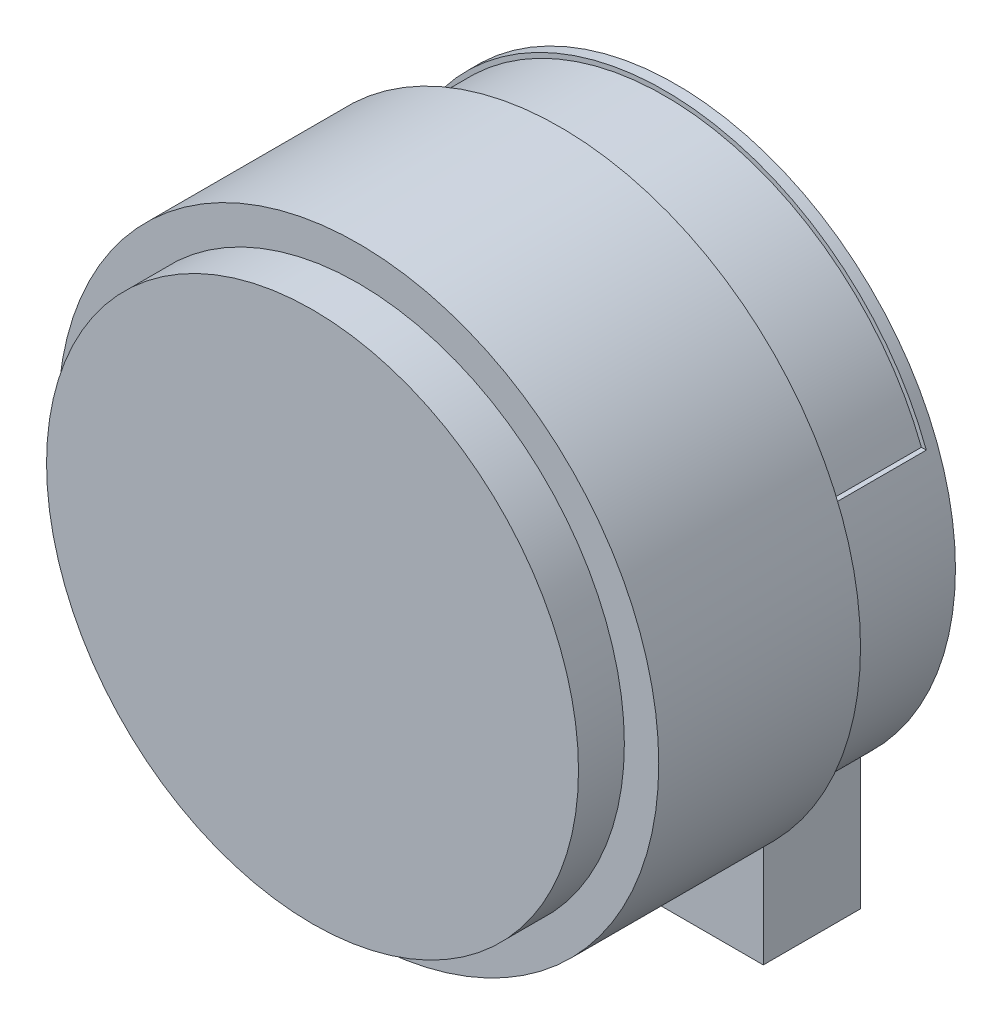
ISO-10303-21;
HEADER;
FILE_DESCRIPTION(('STEP AP214'),'2;1');
FILE_NAME('part.step','',(''),(''),'','','');
FILE_SCHEMA(('AUTOMOTIVE_DESIGN { 1 0 10303 214 1 1 1 1 }'));
ENDSEC;
DATA;
#1=APPLICATION_CONTEXT('core data for automotive mechanical design processes');
#2=APPLICATION_PROTOCOL_DEFINITION('international standard','automotive_design',2000,#1);
#3=PRODUCT_CONTEXT('',#1,'mechanical');
#4=PRODUCT('Part','Part','',(#3));
#5=PRODUCT_RELATED_PRODUCT_CATEGORY('part','',(#4));
#6=PRODUCT_DEFINITION_FORMATION('','',#4);
#7=PRODUCT_DEFINITION_CONTEXT('part definition',#1,'design');
#8=PRODUCT_DEFINITION('design','',#6,#7);
#9=PRODUCT_DEFINITION_SHAPE('','',#8);
#10=(LENGTH_UNIT() NAMED_UNIT(*) SI_UNIT(.MILLI.,.METRE.));
#11=(NAMED_UNIT(*) PLANE_ANGLE_UNIT() SI_UNIT($,.RADIAN.));
#12=(NAMED_UNIT(*) SI_UNIT($,.STERADIAN.) SOLID_ANGLE_UNIT());
#13=UNCERTAINTY_MEASURE_WITH_UNIT(LENGTH_MEASURE(1.E-05),#10,'distance_accuracy_value','');
#14=(GEOMETRIC_REPRESENTATION_CONTEXT(3) GLOBAL_UNCERTAINTY_ASSIGNED_CONTEXT((#13)) GLOBAL_UNIT_ASSIGNED_CONTEXT((#10,
#11,#12)) REPRESENTATION_CONTEXT('',''));
#15=CARTESIAN_POINT('',(0.,0.,0.));
#16=DIRECTION('',(0.,0.,1.));
#17=DIRECTION('',(1.,0.,0.));
#18=AXIS2_PLACEMENT_3D('',#15,#16,#17);
#19=CARTESIAN_POINT('',(0.,0.,12.6));
#20=DIRECTION('',(0.,0.,-1.));
#21=DIRECTION('',(-1.,0.,0.));
#22=AXIS2_PLACEMENT_3D('',#19,#20,#21);
#23=CYLINDRICAL_SURFACE('',#22,30.5);
#24=CARTESIAN_POINT('',(0.,0.,11.7));
#25=DIRECTION('',(0.,0.,-1.));
#26=DIRECTION('',(-1.,0.,0.));
#27=AXIS2_PLACEMENT_3D('',#24,#25,#26);
#28=CIRCLE('',#27,30.5);
#29=CARTESIAN_POINT('',(21.25,-21.8789282187222,11.7));
#30=VERTEX_POINT('',#29);
#31=CARTESIAN_POINT('',(-21.25,-21.8789282187222,11.7));
#32=VERTEX_POINT('',#31);
#33=EDGE_CURVE('E196',#30,#32,#28,.T.);
#34=ORIENTED_EDGE('',*,*,#33,.F.);
#35=DIRECTION('',(0.,0.,-1.));
#36=VECTOR('',#35,1.);
#37=CARTESIAN_POINT('',(21.25,-21.8789282187222,11.7));
#38=LINE('',#37,#36);
#39=CARTESIAN_POINT('',(21.25,-21.8789282187222,1.1));
#40=VERTEX_POINT('',#39);
#41=EDGE_CURVE('E210',#30,#40,#38,.T.);
#42=ORIENTED_EDGE('',*,*,#41,.T.);
#43=CARTESIAN_POINT('',(0.,0.,1.1));
#44=DIRECTION('',(0.,0.,-1.));
#45=DIRECTION('',(-1.,0.,0.));
#46=AXIS2_PLACEMENT_3D('',#43,#44,#45);
#47=CIRCLE('',#46,30.5);
#48=CARTESIAN_POINT('',(-21.25,-21.8789282187222,1.1));
#49=VERTEX_POINT('',#48);
#50=EDGE_CURVE('E182',#40,#49,#47,.T.);
#51=ORIENTED_EDGE('',*,*,#50,.T.);
#52=DIRECTION('',(0.,0.,-1.));
#53=VECTOR('',#52,1.);
#54=CARTESIAN_POINT('',(-21.25,-21.8789282187222,11.7));
#55=LINE('',#54,#53);
#56=EDGE_CURVE('E207',#32,#49,#55,.T.);
#57=ORIENTED_EDGE('',*,*,#56,.F.);
#58=EDGE_LOOP('',(#34,#42,#51,#57));
#59=FACE_BOUND('',#58,.T.);
#60=CARTESIAN_POINT('',(0.,0.,12.6));
#61=DIRECTION('',(0.,0.,1.));
#62=DIRECTION('',(1.,0.,0.));
#63=AXIS2_PLACEMENT_3D('',#60,#61,#62);
#64=CIRCLE('',#63,30.5);
#65=CARTESIAN_POINT('',(30.5,0.,12.6));
#66=VERTEX_POINT('',#65);
#67=EDGE_CURVE('E58',#66,#66,#64,.T.);
#68=ORIENTED_EDGE('',*,*,#67,.F.);
#69=EDGE_LOOP('',(#68));
#70=FACE_BOUND('',#69,.T.);
#71=CARTESIAN_POINT('',(0.,0.,0.));
#72=DIRECTION('',(0.,0.,1.));
#73=DIRECTION('',(1.,0.,0.));
#74=AXIS2_PLACEMENT_3D('',#71,#72,#73);
#75=CIRCLE('',#74,30.5);
#76=CARTESIAN_POINT('',(30.5,0.,0.));
#77=VERTEX_POINT('',#76);
#78=EDGE_CURVE('E52',#77,#77,#75,.T.);
#79=ORIENTED_EDGE('',*,*,#78,.T.);
#80=EDGE_LOOP('',(#79));
#81=FACE_BOUND('',#80,.T.);
#82=CARTESIAN_POINT('',(0.,0.,12.));
#83=DIRECTION('',(0.,0.,-1.));
#84=DIRECTION('',(-1.,0.,0.));
#85=AXIS2_PLACEMENT_3D('',#82,#83,#84);
#86=CIRCLE('',#85,30.5);
#87=CARTESIAN_POINT('',(-28.5238496700568,10.8,12.));
#88=VERTEX_POINT('',#87);
#89=CARTESIAN_POINT('',(28.5238496700568,10.8,12.));
#90=VERTEX_POINT('',#89);
#91=EDGE_CURVE('E143',#88,#90,#86,.T.);
#92=ORIENTED_EDGE('',*,*,#91,.F.);
#93=DIRECTION('',(0.,0.,-1.));
#94=VECTOR('',#93,1.);
#95=CARTESIAN_POINT('',(-28.5238496700568,10.8,12.));
#96=LINE('',#95,#94);
#97=CARTESIAN_POINT('',(-28.5238496700568,10.8,1.2));
#98=VERTEX_POINT('',#97);
#99=EDGE_CURVE('E128',#88,#98,#96,.T.);
#100=ORIENTED_EDGE('',*,*,#99,.T.);
#101=CARTESIAN_POINT('',(0.,0.,1.2));
#102=DIRECTION('',(0.,0.,-1.));
#103=DIRECTION('',(-1.,0.,0.));
#104=AXIS2_PLACEMENT_3D('',#101,#102,#103);
#105=CIRCLE('',#104,30.5);
#106=CARTESIAN_POINT('',(28.5238496700568,10.8,1.2));
#107=VERTEX_POINT('',#106);
#108=EDGE_CURVE('E239',#98,#107,#105,.T.);
#109=ORIENTED_EDGE('',*,*,#108,.T.);
#110=DIRECTION('',(0.,0.,-1.));
#111=VECTOR('',#110,1.);
#112=CARTESIAN_POINT('',(28.5238496700568,10.8,12.));
#113=LINE('',#112,#111);
#114=EDGE_CURVE('E150',#90,#107,#113,.T.);
#115=ORIENTED_EDGE('',*,*,#114,.F.);
#116=EDGE_LOOP('',(#92,#100,#109,#115));
#117=FACE_BOUND('',#116,.T.);
#118=ADVANCED_FACE('F49',(#59,#70,#81,#117),#23,.T.);
#119=CARTESIAN_POINT('',(0.,0.,0.));
#120=DIRECTION('',(0.,0.,1.));
#121=DIRECTION('',(1.,0.,0.));
#122=AXIS2_PLACEMENT_3D('',#119,#120,#121);
#123=PLANE('',#122);
#124=CARTESIAN_POINT('',(0.,0.,0.));
#125=DIRECTION('',(0.,0.,-1.));
#126=DIRECTION('',(-1.,0.,0.));
#127=AXIS2_PLACEMENT_3D('',#124,#125,#126);
#128=CIRCLE('',#127,27.75);
#129=CARTESIAN_POINT('',(-27.75,0.,0.));
#130=VERTEX_POINT('',#129);
#131=EDGE_CURVE('E156',#130,#130,#128,.T.);
#132=ORIENTED_EDGE('',*,*,#131,.F.);
#133=EDGE_LOOP('',(#132));
#134=FACE_BOUND('',#133,.T.);
#135=ORIENTED_EDGE('',*,*,#78,.F.);
#136=EDGE_LOOP('',(#135));
#137=FACE_BOUND('',#136,.T.);
#138=ADVANCED_FACE('F254',(#134,#137),#123,.F.);
#139=CARTESIAN_POINT('',(0.,0.,34.6));
#140=DIRECTION('',(0.,0.,-1.));
#141=DIRECTION('',(-1.,0.,0.));
#142=AXIS2_PLACEMENT_3D('',#139,#140,#141);
#143=CYLINDRICAL_SURFACE('',#142,32.75);
#144=CARTESIAN_POINT('',(0.,0.,34.6));
#145=DIRECTION('',(0.,0.,1.));
#146=DIRECTION('',(1.,0.,0.));
#147=AXIS2_PLACEMENT_3D('',#144,#145,#146);
#148=CIRCLE('',#147,32.75);
#149=CARTESIAN_POINT('',(32.75,0.,34.6));
#150=VERTEX_POINT('',#149);
#151=EDGE_CURVE('E228',#150,#150,#148,.T.);
#152=ORIENTED_EDGE('',*,*,#151,.F.);
#153=EDGE_LOOP('',(#152));
#154=FACE_BOUND('',#153,.T.);
#155=CARTESIAN_POINT('',(0.,0.,12.6));
#156=DIRECTION('',(0.,0.,1.));
#157=DIRECTION('',(1.,0.,0.));
#158=AXIS2_PLACEMENT_3D('',#155,#156,#157);
#159=CIRCLE('',#158,32.75);
#160=CARTESIAN_POINT('',(32.75,0.,12.6));
#161=VERTEX_POINT('',#160);
#162=EDGE_CURVE('E224',#161,#161,#159,.T.);
#163=ORIENTED_EDGE('',*,*,#162,.T.);
#164=EDGE_LOOP('',(#163));
#165=FACE_BOUND('',#164,.T.);
#166=ADVANCED_FACE('F261',(#154,#165),#143,.T.);
#167=CARTESIAN_POINT('',(0.,0.,34.6));
#168=DIRECTION('',(0.,0.,1.));
#169=DIRECTION('',(1.,0.,0.));
#170=AXIS2_PLACEMENT_3D('',#167,#168,#169);
#171=PLANE('',#170);
#172=CARTESIAN_POINT('',(0.,0.,34.6));
#173=DIRECTION('',(0.,0.,1.));
#174=DIRECTION('',(1.,0.,0.));
#175=AXIS2_PLACEMENT_3D('',#172,#173,#174);
#176=CIRCLE('',#175,29.);
#177=CARTESIAN_POINT('',(29.,0.,34.6));
#178=VERTEX_POINT('',#177);
#179=EDGE_CURVE('E11',#178,#178,#176,.T.);
#180=ORIENTED_EDGE('',*,*,#179,.F.);
#181=EDGE_LOOP('',(#180));
#182=FACE_BOUND('',#181,.T.);
#183=ORIENTED_EDGE('',*,*,#151,.T.);
#184=EDGE_LOOP('',(#183));
#185=FACE_BOUND('',#184,.T.);
#186=ADVANCED_FACE('F313',(#182,#185),#171,.T.);
#187=CARTESIAN_POINT('',(0.,0.,12.6));
#188=DIRECTION('',(0.,0.,1.));
#189=DIRECTION('',(1.,0.,0.));
#190=AXIS2_PLACEMENT_3D('',#187,#188,#189);
#191=PLANE('',#190);
#192=ORIENTED_EDGE('',*,*,#67,.T.);
#193=EDGE_LOOP('',(#192));
#194=FACE_BOUND('',#193,.T.);
#195=ORIENTED_EDGE('',*,*,#162,.F.);
#196=EDGE_LOOP('',(#195));
#197=FACE_BOUND('',#196,.T.);
#198=ADVANCED_FACE('F311',(#194,#197),#191,.F.);
#199=CARTESIAN_POINT('',(0.,0.,39.6));
#200=DIRECTION('',(0.,0.,-1.));
#201=DIRECTION('',(-1.,0.,0.));
#202=AXIS2_PLACEMENT_3D('',#199,#200,#201);
#203=CYLINDRICAL_SURFACE('',#202,29.);
#204=CARTESIAN_POINT('',(0.,0.,39.6));
#205=DIRECTION('',(0.,0.,1.));
#206=DIRECTION('',(1.,0.,0.));
#207=AXIS2_PLACEMENT_3D('',#204,#205,#206);
#208=CIRCLE('',#207,29.);
#209=CARTESIAN_POINT('',(29.,0.,39.6));
#210=VERTEX_POINT('',#209);
#211=EDGE_CURVE('E220',#210,#210,#208,.T.);
#212=ORIENTED_EDGE('',*,*,#211,.F.);
#213=EDGE_LOOP('',(#212));
#214=FACE_BOUND('',#213,.T.);
#215=ORIENTED_EDGE('',*,*,#179,.T.);
#216=EDGE_LOOP('',(#215));
#217=FACE_BOUND('',#216,.T.);
#218=ADVANCED_FACE('F307',(#214,#217),#203,.T.);
#219=CARTESIAN_POINT('',(0.,0.,39.6));
#220=DIRECTION('',(0.,0.,1.));
#221=DIRECTION('',(1.,0.,0.));
#222=AXIS2_PLACEMENT_3D('',#219,#220,#221);
#223=PLANE('',#222);
#224=ORIENTED_EDGE('',*,*,#211,.T.);
#225=EDGE_LOOP('',(#224));
#226=FACE_BOUND('',#225,.T.);
#227=ADVANCED_FACE('F304',(#226),#223,.T.);
#228=CARTESIAN_POINT('',(-21.25,0.,11.7));
#229=DIRECTION('',(1.,0.,0.));
#230=DIRECTION('',(0.,0.,-1.));
#231=AXIS2_PLACEMENT_3D('',#228,#229,#230);
#232=PLANE('',#231);
#233=DIRECTION('',(0.,-1.,0.));
#234=VECTOR('',#233,1.);
#235=CARTESIAN_POINT('',(-21.25,0.,1.1));
#236=LINE('',#235,#234);
#237=CARTESIAN_POINT('',(-21.25,-36.2,1.1));
#238=VERTEX_POINT('',#237);
#239=EDGE_CURVE('E74',#49,#238,#236,.T.);
#240=ORIENTED_EDGE('',*,*,#239,.T.);
#241=DIRECTION('',(0.,0.,-1.));
#242=VECTOR('',#241,1.);
#243=CARTESIAN_POINT('',(-21.25,-36.2,11.7));
#244=LINE('',#243,#242);
#245=CARTESIAN_POINT('',(-21.25,-36.2,11.7));
#246=VERTEX_POINT('',#245);
#247=EDGE_CURVE('E217',#246,#238,#244,.T.);
#248=ORIENTED_EDGE('',*,*,#247,.F.);
#249=DIRECTION('',(0.,-1.,0.));
#250=VECTOR('',#249,1.);
#251=CARTESIAN_POINT('',(-21.25,0.,11.7));
#252=LINE('',#251,#250);
#253=EDGE_CURVE('E193',#32,#246,#252,.T.);
#254=ORIENTED_EDGE('',*,*,#253,.F.);
#255=ORIENTED_EDGE('',*,*,#56,.T.);
#256=EDGE_LOOP('',(#240,#248,#254,#255));
#257=FACE_BOUND('',#256,.T.);
#258=ADVANCED_FACE('F276',(#257),#232,.F.);
#259=CARTESIAN_POINT('',(0.,-36.2,11.7));
#260=DIRECTION('',(0.,-1.,0.));
#261=DIRECTION('',(0.,0.,-1.));
#262=AXIS2_PLACEMENT_3D('',#259,#260,#261);
#263=PLANE('',#262);
#264=CARTESIAN_POINT('',(-18.,-36.2,6.4));
#265=DIRECTION('',(0.,-1.,0.));
#266=DIRECTION('',(0.,0.,-1.));
#267=AXIS2_PLACEMENT_3D('',#264,#265,#266);
#268=CIRCLE('',#267,1.5);
#269=CARTESIAN_POINT('',(-18.,-36.2,4.9));
#270=VERTEX_POINT('',#269);
#271=EDGE_CURVE('E172',#270,#270,#268,.T.);
#272=ORIENTED_EDGE('',*,*,#271,.F.);
#273=EDGE_LOOP('',(#272));
#274=FACE_BOUND('',#273,.T.);
#275=CARTESIAN_POINT('',(18.,-36.2,6.4));
#276=DIRECTION('',(0.,-1.,0.));
#277=DIRECTION('',(0.,0.,1.));
#278=AXIS2_PLACEMENT_3D('',#275,#276,#277);
#279=CIRCLE('',#278,1.5);
#280=CARTESIAN_POINT('',(18.,-36.2,7.90000000000001));
#281=VERTEX_POINT('',#280);
#282=EDGE_CURVE('E168',#281,#281,#279,.T.);
#283=ORIENTED_EDGE('',*,*,#282,.F.);
#284=EDGE_LOOP('',(#283));
#285=FACE_BOUND('',#284,.T.);
#286=DIRECTION('',(-1.,0.,0.));
#287=VECTOR('',#286,1.);
#288=CARTESIAN_POINT('',(0.,-36.2,1.1));
#289=LINE('',#288,#287);
#290=CARTESIAN_POINT('',(21.25,-36.2,1.1));
#291=VERTEX_POINT('',#290);
#292=EDGE_CURVE('E190',#291,#238,#289,.T.);
#293=ORIENTED_EDGE('',*,*,#292,.F.);
#294=DIRECTION('',(0.,0.,-1.));
#295=VECTOR('',#294,1.);
#296=CARTESIAN_POINT('',(21.25,-36.2,11.7));
#297=LINE('',#296,#295);
#298=CARTESIAN_POINT('',(21.25,-36.2,11.7));
#299=VERTEX_POINT('',#298);
#300=EDGE_CURVE('E214',#299,#291,#297,.T.);
#301=ORIENTED_EDGE('',*,*,#300,.F.);
#302=DIRECTION('',(-1.,0.,0.));
#303=VECTOR('',#302,1.);
#304=CARTESIAN_POINT('',(0.,-36.2,11.7));
#305=LINE('',#304,#303);
#306=EDGE_CURVE('E203',#299,#246,#305,.T.);
#307=ORIENTED_EDGE('',*,*,#306,.T.);
#308=ORIENTED_EDGE('',*,*,#247,.T.);
#309=EDGE_LOOP('',(#293,#301,#307,#308));
#310=FACE_BOUND('',#309,.T.);
#311=ADVANCED_FACE('F279',(#274,#285,#310),#263,.T.);
#312=CARTESIAN_POINT('',(21.25,0.,11.7));
#313=DIRECTION('',(1.,0.,0.));
#314=DIRECTION('',(0.,0.,-1.));
#315=AXIS2_PLACEMENT_3D('',#312,#313,#314);
#316=PLANE('',#315);
#317=DIRECTION('',(0.,-1.,0.));
#318=VECTOR('',#317,1.);
#319=CARTESIAN_POINT('',(21.25,0.,1.1));
#320=LINE('',#319,#318);
#321=EDGE_CURVE('E186',#40,#291,#320,.T.);
#322=ORIENTED_EDGE('',*,*,#321,.F.);
#323=ORIENTED_EDGE('',*,*,#41,.F.);
#324=DIRECTION('',(0.,-1.,0.));
#325=VECTOR('',#324,1.);
#326=CARTESIAN_POINT('',(21.25,0.,11.7));
#327=LINE('',#326,#325);
#328=EDGE_CURVE('E199',#30,#299,#327,.T.);
#329=ORIENTED_EDGE('',*,*,#328,.T.);
#330=ORIENTED_EDGE('',*,*,#300,.T.);
#331=EDGE_LOOP('',(#322,#323,#329,#330));
#332=FACE_BOUND('',#331,.T.);
#333=ADVANCED_FACE('F282',(#332),#316,.T.);
#334=CARTESIAN_POINT('',(0.,0.,11.7));
#335=DIRECTION('',(0.,0.,-1.));
#336=DIRECTION('',(-1.,0.,0.));
#337=AXIS2_PLACEMENT_3D('',#334,#335,#336);
#338=PLANE('',#337);
#339=ORIENTED_EDGE('',*,*,#253,.T.);
#340=ORIENTED_EDGE('',*,*,#306,.F.);
#341=ORIENTED_EDGE('',*,*,#328,.F.);
#342=ORIENTED_EDGE('',*,*,#33,.T.);
#343=EDGE_LOOP('',(#339,#340,#341,#342));
#344=FACE_BOUND('',#343,.T.);
#345=ADVANCED_FACE('F272',(#344),#338,.F.);
#346=CARTESIAN_POINT('',(0.,0.,1.1));
#347=DIRECTION('',(0.,0.,-1.));
#348=DIRECTION('',(-1.,0.,0.));
#349=AXIS2_PLACEMENT_3D('',#346,#347,#348);
#350=PLANE('',#349);
#351=ORIENTED_EDGE('',*,*,#239,.F.);
#352=ORIENTED_EDGE('',*,*,#50,.F.);
#353=ORIENTED_EDGE('',*,*,#321,.T.);
#354=ORIENTED_EDGE('',*,*,#292,.T.);
#355=EDGE_LOOP('',(#351,#352,#353,#354));
#356=FACE_BOUND('',#355,.T.);
#357=ADVANCED_FACE('F283',(#356),#350,.T.);
#358=CARTESIAN_POINT('',(18.,-31.2,6.4));
#359=DIRECTION('',(0.,-1.,0.));
#360=DIRECTION('',(0.,0.,-1.));
#361=AXIS2_PLACEMENT_3D('',#358,#359,#360);
#362=CYLINDRICAL_SURFACE('',#361,1.5);
#363=CARTESIAN_POINT('',(18.,-31.2,6.4));
#364=DIRECTION('',(0.,-1.,0.));
#365=DIRECTION('',(0.,0.,1.));
#366=AXIS2_PLACEMENT_3D('',#363,#364,#365);
#367=CIRCLE('',#366,1.5);
#368=CARTESIAN_POINT('',(18.,-31.2,7.90000000000001));
#369=VERTEX_POINT('',#368);
#370=EDGE_CURVE('E164',#369,#369,#367,.T.);
#371=ORIENTED_EDGE('',*,*,#370,.F.);
#372=EDGE_LOOP('',(#371));
#373=FACE_BOUND('',#372,.T.);
#374=ORIENTED_EDGE('',*,*,#282,.T.);
#375=EDGE_LOOP('',(#374));
#376=FACE_BOUND('',#375,.T.);
#377=ADVANCED_FACE('F285',(#373,#376),#362,.F.);
#378=CARTESIAN_POINT('',(18.,-31.2,6.4));
#379=DIRECTION('',(0.,1.,0.));
#380=DIRECTION('',(0.,0.,1.));
#381=AXIS2_PLACEMENT_3D('',#378,#379,#380);
#382=PLANE('',#381);
#383=ORIENTED_EDGE('',*,*,#370,.T.);
#384=EDGE_LOOP('',(#383));
#385=FACE_BOUND('',#384,.T.);
#386=ADVANCED_FACE('F292',(#385),#382,.F.);
#387=CARTESIAN_POINT('',(-18.,-31.2,6.4));
#388=DIRECTION('',(0.,-1.,0.));
#389=DIRECTION('',(0.,0.,-1.));
#390=AXIS2_PLACEMENT_3D('',#387,#388,#389);
#391=CYLINDRICAL_SURFACE('',#390,1.5);
#392=CARTESIAN_POINT('',(-18.,-31.2,6.4));
#393=DIRECTION('',(0.,-1.,0.));
#394=DIRECTION('',(0.,0.,-1.));
#395=AXIS2_PLACEMENT_3D('',#392,#393,#394);
#396=CIRCLE('',#395,1.5);
#397=CARTESIAN_POINT('',(-18.,-31.2,4.9));
#398=VERTEX_POINT('',#397);
#399=EDGE_CURVE('E176',#398,#398,#396,.T.);
#400=ORIENTED_EDGE('',*,*,#399,.F.);
#401=EDGE_LOOP('',(#400));
#402=FACE_BOUND('',#401,.T.);
#403=ORIENTED_EDGE('',*,*,#271,.T.);
#404=EDGE_LOOP('',(#403));
#405=FACE_BOUND('',#404,.T.);
#406=ADVANCED_FACE('F385',(#402,#405),#391,.F.);
#407=CARTESIAN_POINT('',(-18.,-31.2,6.4));
#408=DIRECTION('',(0.,-1.,0.));
#409=DIRECTION('',(0.,0.,-1.));
#410=AXIS2_PLACEMENT_3D('',#407,#408,#409);
#411=PLANE('',#410);
#412=ORIENTED_EDGE('',*,*,#399,.T.);
#413=EDGE_LOOP('',(#412));
#414=FACE_BOUND('',#413,.T.);
#415=ADVANCED_FACE('F394',(#414),#411,.T.);
#416=CARTESIAN_POINT('',(0.,0.,2.));
#417=DIRECTION('',(0.,0.,-1.));
#418=DIRECTION('',(-1.,0.,0.));
#419=AXIS2_PLACEMENT_3D('',#416,#417,#418);
#420=CYLINDRICAL_SURFACE('',#419,27.75);
#421=CARTESIAN_POINT('',(0.,0.,2.));
#422=DIRECTION('',(0.,0.,-1.));
#423=DIRECTION('',(-1.,0.,0.));
#424=AXIS2_PLACEMENT_3D('',#421,#422,#423);
#425=CIRCLE('',#424,27.75);
#426=CARTESIAN_POINT('',(-27.75,0.,2.));
#427=VERTEX_POINT('',#426);
#428=EDGE_CURVE('E160',#427,#427,#425,.T.);
#429=ORIENTED_EDGE('',*,*,#428,.F.);
#430=EDGE_LOOP('',(#429));
#431=FACE_BOUND('',#430,.T.);
#432=ORIENTED_EDGE('',*,*,#131,.T.);
#433=EDGE_LOOP('',(#432));
#434=FACE_BOUND('',#433,.T.);
#435=ADVANCED_FACE('F404',(#431,#434),#420,.F.);
#436=CARTESIAN_POINT('',(0.,0.,2.));
#437=DIRECTION('',(0.,0.,-1.));
#438=DIRECTION('',(-1.,0.,0.));
#439=AXIS2_PLACEMENT_3D('',#436,#437,#438);
#440=PLANE('',#439);
#441=ORIENTED_EDGE('',*,*,#428,.T.);
#442=EDGE_LOOP('',(#441));
#443=FACE_BOUND('',#442,.T.);
#444=ADVANCED_FACE('F414',(#443),#440,.T.);
#445=CARTESIAN_POINT('',(0.,0.,12.));
#446=DIRECTION('',(0.,0.,-1.));
#447=DIRECTION('',(-1.,0.,0.));
#448=AXIS2_PLACEMENT_3D('',#445,#446,#447);
#449=CYLINDRICAL_SURFACE('',#448,30.);
#450=CARTESIAN_POINT('',(0.,0.,1.2));
#451=DIRECTION('',(0.,0.,-1.));
#452=DIRECTION('',(-1.,0.,0.));
#453=AXIS2_PLACEMENT_3D('',#450,#451,#452);
#454=CIRCLE('',#453,30.);
#455=CARTESIAN_POINT('',(-27.9885690952574,10.8,1.2));
#456=VERTEX_POINT('',#455);
#457=CARTESIAN_POINT('',(27.9885690952574,10.8,1.2));
#458=VERTEX_POINT('',#457);
#459=EDGE_CURVE('E122',#456,#458,#454,.T.);
#460=ORIENTED_EDGE('',*,*,#459,.F.);
#461=DIRECTION('',(0.,0.,-1.));
#462=VECTOR('',#461,1.);
#463=CARTESIAN_POINT('',(-27.9885690952574,10.8,12.));
#464=LINE('',#463,#462);
#465=CARTESIAN_POINT('',(-27.9885690952574,10.8,12.));
#466=VERTEX_POINT('',#465);
#467=EDGE_CURVE('E117',#466,#456,#464,.T.);
#468=ORIENTED_EDGE('',*,*,#467,.F.);
#469=CARTESIAN_POINT('',(0.,0.,12.));
#470=DIRECTION('',(0.,0.,-1.));
#471=DIRECTION('',(-1.,0.,0.));
#472=AXIS2_PLACEMENT_3D('',#469,#470,#471);
#473=CIRCLE('',#472,30.);
#474=CARTESIAN_POINT('',(27.9885690952574,10.8,12.));
#475=VERTEX_POINT('',#474);
#476=EDGE_CURVE('E120',#466,#475,#473,.T.);
#477=ORIENTED_EDGE('',*,*,#476,.T.);
#478=DIRECTION('',(0.,0.,-1.));
#479=VECTOR('',#478,1.);
#480=CARTESIAN_POINT('',(27.9885690952574,10.8,12.));
#481=LINE('',#480,#479);
#482=EDGE_CURVE('E153',#475,#458,#481,.T.);
#483=ORIENTED_EDGE('',*,*,#482,.T.);
#484=EDGE_LOOP('',(#460,#468,#477,#483));
#485=FACE_BOUND('',#484,.T.);
#486=ADVANCED_FACE('F119',(#485),#449,.T.);
#487=CARTESIAN_POINT('',(0.,10.8,12.));
#488=DIRECTION('',(0.,-1.,0.));
#489=DIRECTION('',(0.,0.,-1.));
#490=AXIS2_PLACEMENT_3D('',#487,#488,#489);
#491=PLANE('',#490);
#492=DIRECTION('',(-1.,0.,0.));
#493=VECTOR('',#492,1.);
#494=CARTESIAN_POINT('',(0.,10.8,1.2));
#495=LINE('',#494,#493);
#496=EDGE_CURVE('E66',#107,#458,#495,.T.);
#497=ORIENTED_EDGE('',*,*,#496,.T.);
#498=ORIENTED_EDGE('',*,*,#482,.F.);
#499=DIRECTION('',(-1.,0.,0.));
#500=VECTOR('',#499,1.);
#501=CARTESIAN_POINT('',(0.,10.8,12.));
#502=LINE('',#501,#500);
#503=EDGE_CURVE('E129',#90,#475,#502,.T.);
#504=ORIENTED_EDGE('',*,*,#503,.F.);
#505=ORIENTED_EDGE('',*,*,#114,.T.);
#506=EDGE_LOOP('',(#497,#498,#504,#505));
#507=FACE_BOUND('',#506,.T.);
#508=ADVANCED_FACE('F249',(#507),#491,.F.);
#509=EDGE_CURVE('E243',#456,#98,#495,.T.);
#510=ORIENTED_EDGE('',*,*,#509,.T.);
#511=ORIENTED_EDGE('',*,*,#99,.F.);
#512=EDGE_CURVE('E135',#466,#88,#502,.T.);
#513=ORIENTED_EDGE('',*,*,#512,.F.);
#514=ORIENTED_EDGE('',*,*,#467,.T.);
#515=EDGE_LOOP('',(#510,#511,#513,#514));
#516=FACE_BOUND('',#515,.T.);
#517=ADVANCED_FACE('F140',(#516),#491,.F.);
#518=CARTESIAN_POINT('',(0.,0.,12.));
#519=DIRECTION('',(0.,0.,-1.));
#520=DIRECTION('',(-1.,0.,0.));
#521=AXIS2_PLACEMENT_3D('',#518,#519,#520);
#522=PLANE('',#521);
#523=ORIENTED_EDGE('',*,*,#476,.F.);
#524=ORIENTED_EDGE('',*,*,#512,.T.);
#525=ORIENTED_EDGE('',*,*,#91,.T.);
#526=ORIENTED_EDGE('',*,*,#503,.T.);
#527=EDGE_LOOP('',(#523,#524,#525,#526));
#528=FACE_BOUND('',#527,.T.);
#529=ADVANCED_FACE('F134',(#528),#522,.T.);
#530=CARTESIAN_POINT('',(0.,0.,1.2));
#531=DIRECTION('',(0.,0.,-1.));
#532=DIRECTION('',(-1.,0.,0.));
#533=AXIS2_PLACEMENT_3D('',#530,#531,#532);
#534=PLANE('',#533);
#535=ORIENTED_EDGE('',*,*,#459,.T.);
#536=ORIENTED_EDGE('',*,*,#496,.F.);
#537=ORIENTED_EDGE('',*,*,#108,.F.);
#538=ORIENTED_EDGE('',*,*,#509,.F.);
#539=EDGE_LOOP('',(#535,#536,#537,#538));
#540=FACE_BOUND('',#539,.T.);
#541=ADVANCED_FACE('F247',(#540),#534,.F.);
#542=CLOSED_SHELL('',(#118,#138,#166,#186,#198,#218,#227,#258,#311,#333,#345,#357,#377,#386,
#406,#415,#435,#444,#486,#508,#517,#529,#541));
#543=MANIFOLD_SOLID_BREP('B2',#542);
#544=ADVANCED_BREP_SHAPE_REPRESENTATION('',(#18,#543),#14);
#545=SHAPE_DEFINITION_REPRESENTATION(#9,#544);
ENDSEC;
END-ISO-10303-21;
